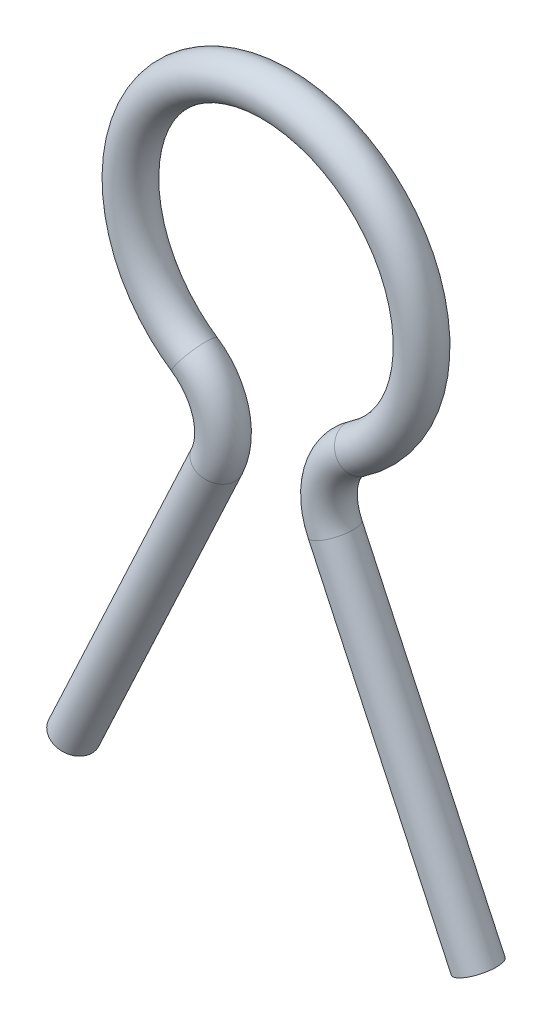
ISO-10303-21;
HEADER;
FILE_DESCRIPTION(('STEP AP214'),'2;1');
FILE_NAME('part.step','',(''),(''),'','','');
FILE_SCHEMA(('AUTOMOTIVE_DESIGN { 1 0 10303 214 1 1 1 1 }'));
ENDSEC;
DATA;
#1=APPLICATION_CONTEXT('core data for automotive mechanical design processes');
#2=APPLICATION_PROTOCOL_DEFINITION('international standard','automotive_design',2000,#1);
#3=PRODUCT_CONTEXT('',#1,'mechanical');
#4=PRODUCT('Part','Part','',(#3));
#5=PRODUCT_RELATED_PRODUCT_CATEGORY('part','',(#4));
#6=PRODUCT_DEFINITION_FORMATION('','',#4);
#7=PRODUCT_DEFINITION_CONTEXT('part definition',#1,'design');
#8=PRODUCT_DEFINITION('design','',#6,#7);
#9=PRODUCT_DEFINITION_SHAPE('','',#8);
#10=(LENGTH_UNIT() NAMED_UNIT(*) SI_UNIT(.MILLI.,.METRE.));
#11=(NAMED_UNIT(*) PLANE_ANGLE_UNIT() SI_UNIT($,.RADIAN.));
#12=(NAMED_UNIT(*) SI_UNIT($,.STERADIAN.) SOLID_ANGLE_UNIT());
#13=UNCERTAINTY_MEASURE_WITH_UNIT(LENGTH_MEASURE(1.E-05),#10,'distance_accuracy_value','');
#14=(GEOMETRIC_REPRESENTATION_CONTEXT(3) GLOBAL_UNCERTAINTY_ASSIGNED_CONTEXT((#13)) GLOBAL_UNIT_ASSIGNED_CONTEXT((#10,
#11,#12)) REPRESENTATION_CONTEXT('',''));
#15=CARTESIAN_POINT('',(0.,0.,0.));
#16=DIRECTION('',(0.,0.,1.));
#17=DIRECTION('',(1.,0.,0.));
#18=AXIS2_PLACEMENT_3D('',#15,#16,#17);
#19=CARTESIAN_POINT('',(0.,0.,0.));
#20=DIRECTION('',(-0.422618261740694,0.906307787036652,0.));
#21=DIRECTION('',(-0.906307787036652,-0.422618261740694,0.));
#22=AXIS2_PLACEMENT_3D('',#19,#20,#21);
#23=PLANE('',#22);
#24=CARTESIAN_POINT('',(0.,0.,0.));
#25=DIRECTION('',(-0.422618261740694,0.906307787036652,0.));
#26=DIRECTION('',(-0.906307787036652,-0.422618261740694,0.));
#27=AXIS2_PLACEMENT_3D('',#24,#25,#26);
#28=CIRCLE('',#27,0.7874);
#29=CARTESIAN_POINT('',(-0.71362675151266,-0.332769619294623,0.));
#30=VERTEX_POINT('',#29);
#31=EDGE_CURVE('E55',#30,#30,#28,.T.);
#32=ORIENTED_EDGE('',*,*,#31,.F.);
#33=EDGE_LOOP('',(#32));
#34=FACE_BOUND('',#33,.T.);
#35=ADVANCED_FACE('F33',(#34),#23,.F.);
#36=CARTESIAN_POINT('',(-15.8749999999997,0.,0.));
#37=DIRECTION('',(-0.4226182617407,-0.906307787036649,0.));
#38=DIRECTION('',(0.906307787036649,-0.4226182617407,0.));
#39=AXIS2_PLACEMENT_3D('',#36,#37,#38);
#40=PLANE('',#39);
#41=CARTESIAN_POINT('',(-15.8749999999997,0.,0.));
#42=DIRECTION('',(-0.4226182617407,-0.906307787036649,0.));
#43=DIRECTION('',(0.906307787036649,-0.4226182617407,0.));
#44=AXIS2_PLACEMENT_3D('',#41,#42,#43);
#45=CIRCLE('',#44,0.7874);
#46=CARTESIAN_POINT('',(-15.161373248487,-0.332769619294624,0.));
#47=VERTEX_POINT('',#46);
#48=EDGE_CURVE('E10',#47,#47,#45,.T.);
#49=ORIENTED_EDGE('',*,*,#48,.T.);
#50=EDGE_LOOP('',(#49));
#51=FACE_BOUND('',#50,.T.);
#52=ADVANCED_FACE('F62',(#51),#40,.T.);
#53=CARTESIAN_POINT('',(0.,0.,0.));
#54=DIRECTION('',(-0.422618261740694,0.906307787036652,0.));
#55=DIRECTION('',(-0.906307787036653,-0.422618261740694,0.));
#56=AXIS2_PLACEMENT_3D('',#53,#54,#55);
#57=CYLINDRICAL_SURFACE('',#56,0.7874);
#58=CARTESIAN_POINT('',(-5.62072660589347,12.0536871046309,0.));
#59=DIRECTION('',(-0.422618261740694,0.906307787036652,0.));
#60=DIRECTION('',(-0.906307787036652,-0.422618261740694,0.));
#61=AXIS2_PLACEMENT_3D('',#58,#59,#60);
#62=CIRCLE('',#61,0.7874);
#63=CARTESIAN_POINT('',(-6.33435335740613,11.7209174853363,0.));
#64=VERTEX_POINT('',#63);
#65=EDGE_CURVE('E52',#64,#64,#62,.T.);
#66=ORIENTED_EDGE('',*,*,#65,.F.);
#67=EDGE_LOOP('',(#66));
#68=FACE_BOUND('',#67,.T.);
#69=ORIENTED_EDGE('',*,*,#31,.T.);
#70=EDGE_LOOP('',(#69));
#71=FACE_BOUND('',#70,.T.);
#72=ADVANCED_FACE('F59',(#68,#71),#57,.T.);
#73=CARTESIAN_POINT('',(-3.31870482682037,13.1271374894523,0.));
#74=DIRECTION('',(0.,0.,-1.));
#75=DIRECTION('',(-1.,0.,0.));
#76=AXIS2_PLACEMENT_3D('',#73,#74,#75);
#77=TOROIDAL_SURFACE('',#76,2.54,0.7874);
#78=CARTESIAN_POINT('',(-4.73987257241405,15.2323410992925,0.));
#79=DIRECTION('',(0.828820318834721,0.559514860469953,0.));
#80=DIRECTION('',(-0.559514860469953,0.828820318834721,0.));
#81=AXIS2_PLACEMENT_3D('',#78,#79,#80);
#82=CIRCLE('',#81,0.7874);
#83=CARTESIAN_POINT('',(-5.18043457354809,15.884954218343,0.));
#84=VERTEX_POINT('',#83);
#85=EDGE_CURVE('E47',#84,#84,#82,.T.);
#86=CARTESIAN_POINT('',(-3.31870482682037,13.1271374894523,0.));
#87=DIRECTION('',(0.,0.,-1.));
#88=DIRECTION('',(-1.,0.,0.));
#89=AXIS2_PLACEMENT_3D('',#86,#87,#88);
#90=CIRCLE('',#89,3.3274);
#91=EDGE_CURVE('',#64,#84,#90,.T.);
#92=ORIENTED_EDGE('',*,*,#65,.T.);
#93=ORIENTED_EDGE('',*,*,#85,.F.);
#94=ORIENTED_EDGE('',*,*,#91,.T.);
#95=ORIENTED_EDGE('',*,*,#91,.F.);
#96=EDGE_LOOP('',(#92,#94,#93,#95));
#97=FACE_BOUND('',#96,.T.);
#98=ADVANCED_FACE('F80',(#97),#77,.T.);
#99=CARTESIAN_POINT('',(-7.93749999999981,19.9690492214329,0.));
#100=DIRECTION('',(0.,0.,1.));
#101=DIRECTION('',(1.,0.,0.));
#102=AXIS2_PLACEMENT_3D('',#99,#100,#101);
#103=TOROIDAL_SURFACE('',#102,5.71499999999998,0.7874);
#104=CARTESIAN_POINT('',(-11.1351274275856,15.2323410992925,0.));
#105=DIRECTION('',(0.828820318834724,-0.559514860469949,0.));
#106=DIRECTION('',(0.559514860469949,0.828820318834724,0.));
#107=AXIS2_PLACEMENT_3D('',#104,#105,#106);
#108=CIRCLE('',#107,0.7874);
#109=CARTESIAN_POINT('',(-10.6945654264515,15.8849542183429,0.));
#110=VERTEX_POINT('',#109);
#111=EDGE_CURVE('E43',#110,#110,#108,.T.);
#112=ORIENTED_EDGE('',*,*,#111,.F.);
#113=EDGE_LOOP('',(#112));
#114=FACE_BOUND('',#113,.T.);
#115=ORIENTED_EDGE('',*,*,#85,.T.);
#116=EDGE_LOOP('',(#115));
#117=FACE_BOUND('',#116,.T.);
#118=ADVANCED_FACE('F74',(#114,#117),#103,.T.);
#119=CARTESIAN_POINT('',(-12.5562951731792,13.1271374894522,0.));
#120=DIRECTION('',(0.,0.,-1.));
#121=DIRECTION('',(-1.,0.,0.));
#122=AXIS2_PLACEMENT_3D('',#119,#120,#121);
#123=TOROIDAL_SURFACE('',#122,2.54,0.7874);
#124=CARTESIAN_POINT('',(-10.2542733941061,12.0536871046309,0.));
#125=DIRECTION('',(-0.4226182617407,-0.906307787036649,0.));
#126=DIRECTION('',(0.906307787036649,-0.4226182617407,0.));
#127=AXIS2_PLACEMENT_3D('',#124,#125,#126);
#128=CIRCLE('',#127,0.7874);
#129=CARTESIAN_POINT('',(-9.54064664259349,11.7209174853362,0.));
#130=VERTEX_POINT('',#129);
#131=EDGE_CURVE('E39',#130,#130,#128,.T.);
#132=CARTESIAN_POINT('',(-12.5562951731792,13.1271374894522,0.));
#133=DIRECTION('',(0.,0.,-1.));
#134=DIRECTION('',(-1.,0.,0.));
#135=AXIS2_PLACEMENT_3D('',#132,#133,#134);
#136=CIRCLE('',#135,3.3274);
#137=EDGE_CURVE('',#110,#130,#136,.T.);
#138=ORIENTED_EDGE('',*,*,#111,.T.);
#139=ORIENTED_EDGE('',*,*,#131,.F.);
#140=ORIENTED_EDGE('',*,*,#137,.T.);
#141=ORIENTED_EDGE('',*,*,#137,.F.);
#142=EDGE_LOOP('',(#138,#140,#139,#141));
#143=FACE_BOUND('',#142,.T.);
#144=ADVANCED_FACE('F68',(#143),#123,.T.);
#145=CARTESIAN_POINT('',(-10.2542733941061,12.0536871046309,0.));
#146=DIRECTION('',(-0.4226182617407,-0.906307787036649,0.));
#147=DIRECTION('',(0.90630778703665,-0.4226182617407,0.));
#148=AXIS2_PLACEMENT_3D('',#145,#146,#147);
#149=CYLINDRICAL_SURFACE('',#148,0.7874);
#150=CARTESIAN_POINT('',(-15.161373248487,-0.332769619294624,0.));
#151=CARTESIAN_POINT('',(-15.102824013009,-0.207210378621386,0.));
#152=CARTESIAN_POINT('',(-15.0442747775309,-0.0816511379481484,0.));
#153=CARTESIAN_POINT('',(-14.9271763065748,0.169467343398328,0.));
#154=CARTESIAN_POINT('',(-14.8686270710967,0.295026584071566,0.));
#155=CARTESIAN_POINT('',(-14.7515286001406,0.546145065418043,0.));
#156=CARTESIAN_POINT('',(-14.6929793646626,0.671704306091282,0.));
#157=CARTESIAN_POINT('',(-14.5758808937065,0.922822787437758,0.));
#158=CARTESIAN_POINT('',(-14.5173316582284,1.048382028111,0.));
#159=CARTESIAN_POINT('',(-14.4002331872723,1.29950050945747,0.));
#160=CARTESIAN_POINT('',(-14.3416839517942,1.42505975013071,0.));
#161=CARTESIAN_POINT('',(-14.2245854808381,1.67617823147719,0.));
#162=CARTESIAN_POINT('',(-14.16603624536,1.80173747215042,0.));
#163=CARTESIAN_POINT('',(-14.0489377744039,2.0528559534969,0.));
#164=CARTESIAN_POINT('',(-13.9903885389259,2.17841519417014,0.));
#165=CARTESIAN_POINT('',(-13.8732900679698,2.42953367551661,0.));
#166=CARTESIAN_POINT('',(-13.8147408324917,2.55509291618985,0.));
#167=CARTESIAN_POINT('',(-13.6976423615356,2.80621139753633,0.));
#168=CARTESIAN_POINT('',(-13.6390931260575,2.93177063820957,0.));
#169=CARTESIAN_POINT('',(-13.5219946551014,3.18288911955604,0.));
#170=CARTESIAN_POINT('',(-13.4634454196234,3.30844836022928,0.));
#171=CARTESIAN_POINT('',(-13.3463469486672,3.55956684157576,0.));
#172=CARTESIAN_POINT('',(-13.2877977131892,3.685126082249,0.));
#173=CARTESIAN_POINT('',(-13.1706992422331,3.93624456359547,0.));
#174=CARTESIAN_POINT('',(-13.112150006755,4.06180380426871,0.));
#175=CARTESIAN_POINT('',(-12.9950515357989,4.31292228561519,0.));
#176=CARTESIAN_POINT('',(-12.9365023003208,4.43848152628843,0.));
#177=CARTESIAN_POINT('',(-12.8194038293647,4.6896000076349,0.));
#178=CARTESIAN_POINT('',(-12.7608545938867,4.81515924830814,0.));
#179=CARTESIAN_POINT('',(-12.6437561229305,5.06627772965462,0.));
#180=CARTESIAN_POINT('',(-12.5852068874525,5.19183697032785,0.));
#181=CARTESIAN_POINT('',(-12.4681084164964,5.44295545167433,0.));
#182=CARTESIAN_POINT('',(-12.4095591810183,5.56851469234757,0.));
#183=CARTESIAN_POINT('',(-12.2924607100622,5.81963317369404,0.));
#184=CARTESIAN_POINT('',(-12.2339114745841,5.94519241436728,0.));
#185=CARTESIAN_POINT('',(-12.116813003628,6.19631089571376,0.));
#186=CARTESIAN_POINT('',(-12.05826376815,6.321870136387,0.));
#187=CARTESIAN_POINT('',(-11.9411652971939,6.57298861773347,0.));
#188=CARTESIAN_POINT('',(-11.8826160617158,6.69854785840671,0.));
#189=CARTESIAN_POINT('',(-11.7655175907597,6.94966633975319,0.));
#190=CARTESIAN_POINT('',(-11.7069683552816,7.07522558042643,0.));
#191=CARTESIAN_POINT('',(-11.5898698843255,7.3263440617729,0.));
#192=CARTESIAN_POINT('',(-11.5313206488475,7.45190330244614,0.));
#193=CARTESIAN_POINT('',(-11.4142221778913,7.70302178379262,0.));
#194=CARTESIAN_POINT('',(-11.3556729424133,7.82858102446586,0.));
#195=CARTESIAN_POINT('',(-11.2385744714572,8.07969950581233,0.));
#196=CARTESIAN_POINT('',(-11.1800252359791,8.20525874648557,0.));
#197=CARTESIAN_POINT('',(-11.062926765023,8.45637722783205,0.));
#198=CARTESIAN_POINT('',(-11.0043775295449,8.58193646850528,0.));
#199=CARTESIAN_POINT('',(-10.8872790585888,8.83305494985176,0.));
#200=CARTESIAN_POINT('',(-10.8287298231108,8.958614190525,0.));
#201=CARTESIAN_POINT('',(-10.7116313521546,9.20973267187147,0.));
#202=CARTESIAN_POINT('',(-10.6530821166766,9.33529191254471,0.));
#203=CARTESIAN_POINT('',(-10.5359836457205,9.58641039389119,0.));
#204=CARTESIAN_POINT('',(-10.4774344102424,9.71196963456443,0.));
#205=CARTESIAN_POINT('',(-10.3603359392863,9.9630881159109,0.));
#206=CARTESIAN_POINT('',(-10.3017867038082,10.0886473565841,0.));
#207=CARTESIAN_POINT('',(-10.1846882328521,10.3397658379306,0.));
#208=CARTESIAN_POINT('',(-10.1261389973741,10.4653250786039,0.));
#209=CARTESIAN_POINT('',(-10.009040526418,10.7164435599503,0.));
#210=CARTESIAN_POINT('',(-9.95049129093989,10.8420028006236,0.));
#211=CARTESIAN_POINT('',(-9.83339281998378,11.09312128197,0.));
#212=CARTESIAN_POINT('',(-9.77484358450572,11.2186805226433,0.));
#213=CARTESIAN_POINT('',(-9.65774511354961,11.4697990039898,0.));
#214=CARTESIAN_POINT('',(-9.59919587807155,11.595358244663,0.));
#215=CARTESIAN_POINT('',(-9.54064664259349,11.7209174853362,0.));
#216=B_SPLINE_CURVE_WITH_KNOTS('',3,(#150,#151,#152,#153,#154,#155,#156,#157,#158,#159,#160,
#161,#162,#163,#164,#165,#166,#167,#168,#169,#170,#171,#172,#173,#174,#175,#176,#177,#178,#179,
#180,#181,#182,#183,#184,#185,#186,#187,#188,#189,#190,#191,#192,#193,#194,#195,#196,#197,#198,
#199,#200,#201,#202,#203,#204,#205,#206,#207,#208,#209,#210,#211,#212,#213,#214,#215),
.UNSPECIFIED.,.F.,.F.,(4,2,2,2,2,2,2,2,2,2,2,2,2,2,2,2,2,2,2,2,2,2,2,2,2,2,2,2,2,2,2,2,4),(0.,
0.415617881041644,0.83123576208329,1.24685364312494,1.66247152416658,2.07808940520822,
2.49370728624987,2.90932516729151,3.32494304833316,3.7405609293748,4.15617881041645,
4.57179669145809,4.98741457249974,5.40303245354138,5.81865033458303,6.23426821562467,
6.64988609666631,7.06550397770796,7.4811218587496,7.89673973979125,8.31235762083289,
8.72797550187454,9.14359338291618,9.55921126395783,9.97482914499947,10.3904470260411,
10.8060649070828,11.2216827881244,11.6373006691661,12.0529185502077,12.4685364312493,
12.884154312291,13.2997721933326),.UNSPECIFIED.);
#217=EDGE_CURVE('BSEAM66',#47,#130,#216,.T.);
#218=ORIENTED_EDGE('',*,*,#48,.F.);
#219=ORIENTED_EDGE('',*,*,#131,.T.);
#220=ORIENTED_EDGE('',*,*,#217,.T.);
#221=ORIENTED_EDGE('',*,*,#217,.F.);
#222=EDGE_LOOP('',(#218,#220,#219,#221));
#223=FACE_BOUND('',#222,.T.);
#224=ADVANCED_FACE('F66',(#223),#149,.T.);
#225=CLOSED_SHELL('',(#35,#52,#72,#98,#118,#144,#224));
#226=MANIFOLD_SOLID_BREP('B2',#225);
#227=ADVANCED_BREP_SHAPE_REPRESENTATION('',(#18,#226),#14);
#228=SHAPE_DEFINITION_REPRESENTATION(#9,#227);
ENDSEC;
END-ISO-10303-21;
